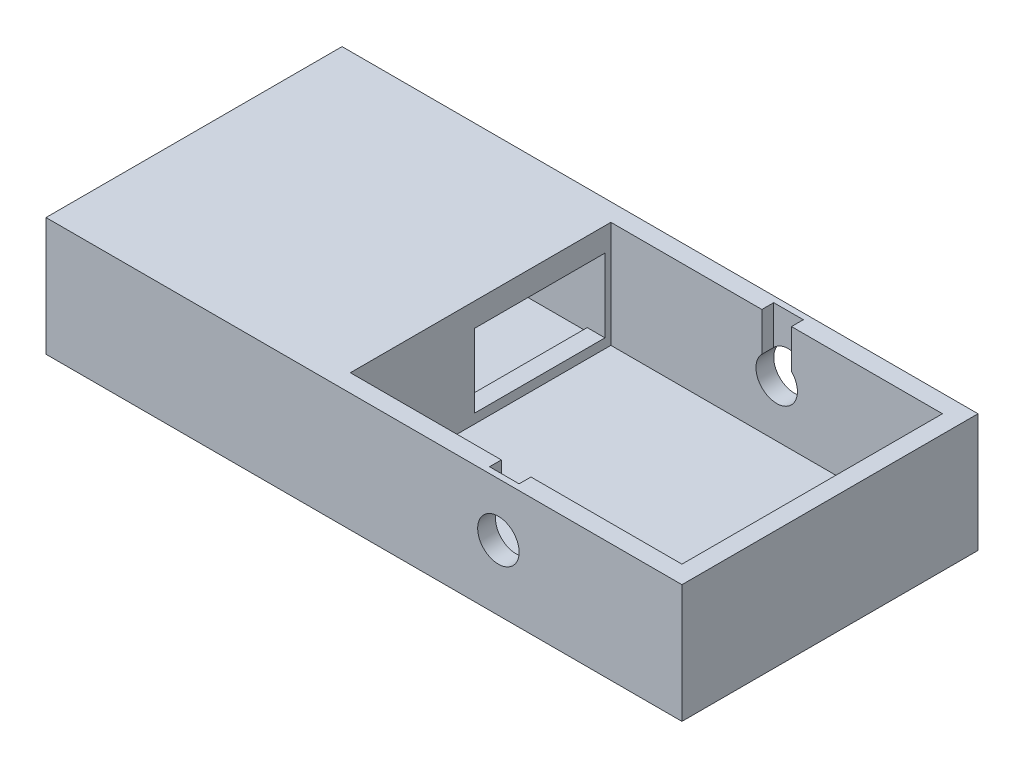
ISO-10303-21;
HEADER;
FILE_DESCRIPTION(('STEP AP214'),'2;1');
FILE_NAME('part.step','',(''),(''),'','','');
FILE_SCHEMA(('AUTOMOTIVE_DESIGN { 1 0 10303 214 1 1 1 1 }'));
ENDSEC;
DATA;
#1=APPLICATION_CONTEXT('core data for automotive mechanical design processes');
#2=APPLICATION_PROTOCOL_DEFINITION('international standard','automotive_design',2000,#1);
#3=PRODUCT_CONTEXT('',#1,'mechanical');
#4=PRODUCT('Part','Part','',(#3));
#5=PRODUCT_RELATED_PRODUCT_CATEGORY('part','',(#4));
#6=PRODUCT_DEFINITION_FORMATION('','',#4);
#7=PRODUCT_DEFINITION_CONTEXT('part definition',#1,'design');
#8=PRODUCT_DEFINITION('design','',#6,#7);
#9=PRODUCT_DEFINITION_SHAPE('','',#8);
#10=(LENGTH_UNIT() NAMED_UNIT(*) SI_UNIT(.MILLI.,.METRE.));
#11=(NAMED_UNIT(*) PLANE_ANGLE_UNIT() SI_UNIT($,.RADIAN.));
#12=(NAMED_UNIT(*) SI_UNIT($,.STERADIAN.) SOLID_ANGLE_UNIT());
#13=UNCERTAINTY_MEASURE_WITH_UNIT(LENGTH_MEASURE(1.E-05),#10,'distance_accuracy_value','');
#14=(GEOMETRIC_REPRESENTATION_CONTEXT(3) GLOBAL_UNCERTAINTY_ASSIGNED_CONTEXT((#13)) GLOBAL_UNIT_ASSIGNED_CONTEXT((#10,
#11,#12)) REPRESENTATION_CONTEXT('',''));
#15=CARTESIAN_POINT('',(0.,0.,0.));
#16=DIRECTION('',(0.,0.,1.));
#17=DIRECTION('',(1.,0.,0.));
#18=AXIS2_PLACEMENT_3D('',#15,#16,#17);
#19=CARTESIAN_POINT('',(-35.56,4.572,1.27));
#20=DIRECTION('',(0.,0.,1.));
#21=DIRECTION('',(1.,0.,0.));
#22=AXIS2_PLACEMENT_3D('',#19,#20,#21);
#23=PLANE('',#22);
#24=DIRECTION('',(0.,-1.,0.));
#25=VECTOR('',#24,1.);
#26=CARTESIAN_POINT('',(-86.868,4.572,1.27000000000001));
#27=LINE('',#26,#25);
#28=CARTESIAN_POINT('',(-86.868,20.32,1.27000000000001));
#29=VERTEX_POINT('',#28);
#30=CARTESIAN_POINT('',(-86.868,3.81,1.27));
#31=VERTEX_POINT('',#30);
#32=EDGE_CURVE('E349',#29,#31,#27,.T.);
#33=ORIENTED_EDGE('',*,*,#32,.F.);
#34=DIRECTION('',(-1.,0.,0.));
#35=VECTOR('',#34,1.);
#36=CARTESIAN_POINT('',(-35.56,20.32,1.27));
#37=LINE('',#36,#35);
#38=CARTESIAN_POINT('',(-35.56,20.32,1.27));
#39=VERTEX_POINT('',#38);
#40=EDGE_CURVE('E477',#39,#29,#37,.T.);
#41=ORIENTED_EDGE('',*,*,#40,.F.);
#42=DIRECTION('',(0.,1.,0.));
#43=VECTOR('',#42,1.);
#44=CARTESIAN_POINT('',(-35.56,4.572,1.27));
#45=LINE('',#44,#43);
#46=CARTESIAN_POINT('',(-35.56,4.572,1.27));
#47=VERTEX_POINT('',#46);
#48=EDGE_CURVE('E461',#47,#39,#45,.T.);
#49=ORIENTED_EDGE('',*,*,#48,.F.);
#50=DIRECTION('',(-1.,0.,0.));
#51=VECTOR('',#50,1.);
#52=CARTESIAN_POINT('',(-35.56,4.572,1.27));
#53=LINE('',#52,#51);
#54=CARTESIAN_POINT('',(-39.37,4.572,1.27));
#55=VERTEX_POINT('',#54);
#56=EDGE_CURVE('E481',#47,#55,#53,.T.);
#57=ORIENTED_EDGE('',*,*,#56,.T.);
#58=DIRECTION('',(0.,1.,0.));
#59=VECTOR('',#58,1.);
#60=CARTESIAN_POINT('',(-39.37,0.,1.27));
#61=LINE('',#60,#59);
#62=CARTESIAN_POINT('',(-39.37,3.81,1.27));
#63=VERTEX_POINT('',#62);
#64=EDGE_CURVE('E358',#63,#55,#61,.T.);
#65=ORIENTED_EDGE('',*,*,#64,.F.);
#66=DIRECTION('',(1.,0.,0.));
#67=VECTOR('',#66,1.);
#68=CARTESIAN_POINT('',(-88.138,3.81,1.27));
#69=LINE('',#68,#67);
#70=EDGE_CURVE('E371',#31,#63,#69,.T.);
#71=ORIENTED_EDGE('',*,*,#70,.F.);
#72=EDGE_LOOP('',(#33,#41,#49,#57,#65,#71));
#73=FACE_BOUND('',#72,.T.);
#74=ADVANCED_FACE('F112',(#73),#23,.F.);
#75=CARTESIAN_POINT('',(-35.56,4.572,-26.67));
#76=DIRECTION('',(0.,0.,-1.));
#77=DIRECTION('',(-1.,0.,0.));
#78=AXIS2_PLACEMENT_3D('',#75,#76,#77);
#79=PLANE('',#78);
#80=DIRECTION('',(0.,1.,0.));
#81=VECTOR('',#80,1.);
#82=CARTESIAN_POINT('',(-86.868,4.572,-26.67));
#83=LINE('',#82,#81);
#84=CARTESIAN_POINT('',(-86.868,3.81,-26.67));
#85=VERTEX_POINT('',#84);
#86=CARTESIAN_POINT('',(-86.868,20.32,-26.67));
#87=VERTEX_POINT('',#86);
#88=EDGE_CURVE('E346',#85,#87,#83,.T.);
#89=ORIENTED_EDGE('',*,*,#88,.F.);
#90=DIRECTION('',(1.,0.,0.));
#91=VECTOR('',#90,1.);
#92=CARTESIAN_POINT('',(-88.138,3.81,-26.67));
#93=LINE('',#92,#91);
#94=CARTESIAN_POINT('',(-39.37,3.81,-26.67));
#95=VERTEX_POINT('',#94);
#96=EDGE_CURVE('E368',#85,#95,#93,.T.);
#97=ORIENTED_EDGE('',*,*,#96,.T.);
#98=DIRECTION('',(0.,1.,0.));
#99=VECTOR('',#98,1.);
#100=CARTESIAN_POINT('',(-39.37,0.,-26.67));
#101=LINE('',#100,#99);
#102=CARTESIAN_POINT('',(-39.37,4.572,-26.67));
#103=VERTEX_POINT('',#102);
#104=EDGE_CURVE('E365',#95,#103,#101,.T.);
#105=ORIENTED_EDGE('',*,*,#104,.T.);
#106=DIRECTION('',(-1.,0.,0.));
#107=VECTOR('',#106,1.);
#108=CARTESIAN_POINT('',(-35.56,4.572,-26.67));
#109=LINE('',#108,#107);
#110=CARTESIAN_POINT('',(-35.56,4.572,-26.67));
#111=VERTEX_POINT('',#110);
#112=EDGE_CURVE('E486',#111,#103,#109,.T.);
#113=ORIENTED_EDGE('',*,*,#112,.F.);
#114=DIRECTION('',(0.,-1.,0.));
#115=VECTOR('',#114,1.);
#116=CARTESIAN_POINT('',(-35.56,4.572,-26.67));
#117=LINE('',#116,#115);
#118=CARTESIAN_POINT('',(-35.56,20.32,-26.67));
#119=VERTEX_POINT('',#118);
#120=EDGE_CURVE('E469',#119,#111,#117,.T.);
#121=ORIENTED_EDGE('',*,*,#120,.F.);
#122=DIRECTION('',(-1.,0.,0.));
#123=VECTOR('',#122,1.);
#124=CARTESIAN_POINT('',(-35.56,20.32,-26.67));
#125=LINE('',#124,#123);
#126=EDGE_CURVE('E490',#119,#87,#125,.T.);
#127=ORIENTED_EDGE('',*,*,#126,.T.);
#128=EDGE_LOOP('',(#89,#97,#105,#113,#121,#127));
#129=FACE_BOUND('',#128,.T.);
#130=ADVANCED_FACE('F623',(#129),#79,.F.);
#131=CARTESIAN_POINT('',(-35.56,20.32,-26.67));
#132=DIRECTION('',(0.,1.,0.));
#133=DIRECTION('',(0.,0.,1.));
#134=AXIS2_PLACEMENT_3D('',#131,#132,#133);
#135=PLANE('',#134);
#136=DIRECTION('',(0.,0.,1.));
#137=VECTOR('',#136,1.);
#138=CARTESIAN_POINT('',(-86.868,20.32,-26.67));
#139=LINE('',#138,#137);
#140=EDGE_CURVE('E352',#87,#29,#139,.T.);
#141=ORIENTED_EDGE('',*,*,#140,.F.);
#142=ORIENTED_EDGE('',*,*,#126,.F.);
#143=DIRECTION('',(0.,0.,-1.));
#144=VECTOR('',#143,1.);
#145=CARTESIAN_POINT('',(-35.56,20.32,-26.67));
#146=LINE('',#145,#144);
#147=EDGE_CURVE('E465',#39,#119,#146,.T.);
#148=ORIENTED_EDGE('',*,*,#147,.F.);
#149=ORIENTED_EDGE('',*,*,#40,.T.);
#150=EDGE_LOOP('',(#141,#142,#148,#149));
#151=FACE_BOUND('',#150,.T.);
#152=ADVANCED_FACE('F629',(#151),#135,.F.);
#153=CARTESIAN_POINT('',(-88.138,3.81,0.));
#154=DIRECTION('',(0.,1.,0.));
#155=DIRECTION('',(0.,0.,1.));
#156=AXIS2_PLACEMENT_3D('',#153,#154,#155);
#157=PLANE('',#156);
#158=ORIENTED_EDGE('',*,*,#96,.F.);
#159=DIRECTION('',(0.,0.,1.));
#160=VECTOR('',#159,1.);
#161=CARTESIAN_POINT('',(-86.868,3.81,0.));
#162=LINE('',#161,#160);
#163=EDGE_CURVE('E342',#85,#31,#162,.T.);
#164=ORIENTED_EDGE('',*,*,#163,.T.);
#165=ORIENTED_EDGE('',*,*,#70,.T.);
#166=DIRECTION('',(0.,0.,1.));
#167=VECTOR('',#166,1.);
#168=CARTESIAN_POINT('',(-39.37,3.81,0.));
#169=LINE('',#168,#167);
#170=EDGE_CURVE('E361',#95,#63,#169,.T.);
#171=ORIENTED_EDGE('',*,*,#170,.F.);
#172=EDGE_LOOP('',(#158,#164,#165,#171));
#173=FACE_BOUND('',#172,.T.);
#174=ADVANCED_FACE('F643',(#173),#157,.T.);
#175=CARTESIAN_POINT('',(-35.56,25.4,-27.94));
#176=DIRECTION('',(0.,0.,1.));
#177=DIRECTION('',(1.,0.,0.));
#178=AXIS2_PLACEMENT_3D('',#175,#176,#177);
#179=PLANE('',#178);
#180=CARTESIAN_POINT('',(0.,13.97,-27.94));
#181=DIRECTION('',(0.,0.,1.));
#182=DIRECTION('',(1.,0.,0.));
#183=AXIS2_PLACEMENT_3D('',#180,#181,#182);
#184=CIRCLE('',#183,4.445);
#185=CARTESIAN_POINT('',(-3.17500000000002,17.0808519733346,-27.94));
#186=VERTEX_POINT('',#185);
#187=CARTESIAN_POINT('',(3.17499999999999,17.0808519733346,-27.94));
#188=VERTEX_POINT('',#187);
#189=EDGE_CURVE('E401',#186,#188,#184,.T.);
#190=ORIENTED_EDGE('',*,*,#189,.F.);
#191=DIRECTION('',(0.,1.,0.));
#192=VECTOR('',#191,1.);
#193=CARTESIAN_POINT('',(-3.17500000000002,0.,-27.94));
#194=LINE('',#193,#192);
#195=CARTESIAN_POINT('',(-3.17500000000002,25.4,-27.94));
#196=VERTEX_POINT('',#195);
#197=EDGE_CURVE('E380',#186,#196,#194,.T.);
#198=ORIENTED_EDGE('',*,*,#197,.T.);
#199=DIRECTION('',(-1.,0.,0.));
#200=VECTOR('',#199,1.);
#201=CARTESIAN_POINT('',(-35.56,25.4,-27.94));
#202=LINE('',#201,#200);
#203=CARTESIAN_POINT('',(-35.56,25.4,-27.94));
#204=VERTEX_POINT('',#203);
#205=EDGE_CURVE('E499',#196,#204,#202,.T.);
#206=ORIENTED_EDGE('',*,*,#205,.T.);
#207=DIRECTION('',(0.,-1.,0.));
#208=VECTOR('',#207,1.);
#209=CARTESIAN_POINT('',(-35.56,25.4,-27.94));
#210=LINE('',#209,#208);
#211=CARTESIAN_POINT('',(-35.56,2.54,-27.94));
#212=VERTEX_POINT('',#211);
#213=EDGE_CURVE('E520',#204,#212,#210,.T.);
#214=ORIENTED_EDGE('',*,*,#213,.T.);
#215=DIRECTION('',(1.,0.,0.));
#216=VECTOR('',#215,1.);
#217=CARTESIAN_POINT('',(-35.56,2.54,-27.94));
#218=LINE('',#217,#216);
#219=CARTESIAN_POINT('',(35.56,2.54,-27.94));
#220=VERTEX_POINT('',#219);
#221=EDGE_CURVE('E565',#212,#220,#218,.T.);
#222=ORIENTED_EDGE('',*,*,#221,.T.);
#223=DIRECTION('',(0.,-1.,0.));
#224=VECTOR('',#223,1.);
#225=CARTESIAN_POINT('',(35.56,25.4,-27.94));
#226=LINE('',#225,#224);
#227=CARTESIAN_POINT('',(35.56,25.4,-27.94));
#228=VERTEX_POINT('',#227);
#229=EDGE_CURVE('E524',#228,#220,#226,.T.);
#230=ORIENTED_EDGE('',*,*,#229,.F.);
#231=CARTESIAN_POINT('',(3.17499999999998,25.4,-27.94));
#232=VERTEX_POINT('',#231);
#233=EDGE_CURVE('E500',#228,#232,#202,.T.);
#234=ORIENTED_EDGE('',*,*,#233,.T.);
#235=DIRECTION('',(0.,1.,0.));
#236=VECTOR('',#235,1.);
#237=CARTESIAN_POINT('',(3.17499999999999,0.,-27.94));
#238=LINE('',#237,#236);
#239=EDGE_CURVE('E374',#188,#232,#238,.T.);
#240=ORIENTED_EDGE('',*,*,#239,.F.);
#241=EDGE_LOOP('',(#190,#198,#206,#214,#222,#230,#234,#240));
#242=FACE_BOUND('',#241,.T.);
#243=ADVANCED_FACE('F579',(#242),#179,.T.);
#244=CARTESIAN_POINT('',(0.,25.4,0.));
#245=DIRECTION('',(0.,1.,0.));
#246=DIRECTION('',(0.,0.,1.));
#247=AXIS2_PLACEMENT_3D('',#244,#245,#246);
#248=PLANE('',#247);
#249=DIRECTION('',(1.,0.,0.));
#250=VECTOR('',#249,1.);
#251=CARTESIAN_POINT('',(-39.37,25.4,31.75));
#252=LINE('',#251,#250);
#253=CARTESIAN_POINT('',(-97.028,25.4,31.75));
#254=VERTEX_POINT('',#253);
#255=CARTESIAN_POINT('',(39.37,25.4,31.75));
#256=VERTEX_POINT('',#255);
#257=EDGE_CURVE('E538',#254,#256,#252,.T.);
#258=ORIENTED_EDGE('',*,*,#257,.T.);
#259=DIRECTION('',(0.,0.,-1.));
#260=VECTOR('',#259,1.);
#261=CARTESIAN_POINT('',(39.37,25.4,-31.75));
#262=LINE('',#261,#260);
#263=CARTESIAN_POINT('',(39.37,25.4,-31.75));
#264=VERTEX_POINT('',#263);
#265=EDGE_CURVE('E529',#256,#264,#262,.T.);
#266=ORIENTED_EDGE('',*,*,#265,.T.);
#267=DIRECTION('',(-1.,0.,0.));
#268=VECTOR('',#267,1.);
#269=CARTESIAN_POINT('',(-39.37,25.4,-31.75));
#270=LINE('',#269,#268);
#271=CARTESIAN_POINT('',(-97.028,25.4,-31.75));
#272=VERTEX_POINT('',#271);
#273=EDGE_CURVE('E533',#264,#272,#270,.T.);
#274=ORIENTED_EDGE('',*,*,#273,.T.);
#275=DIRECTION('',(0.,0.,-1.));
#276=VECTOR('',#275,1.);
#277=CARTESIAN_POINT('',(-97.028,25.4,-31.75));
#278=LINE('',#277,#276);
#279=EDGE_CURVE('E339',#254,#272,#278,.T.);
#280=ORIENTED_EDGE('',*,*,#279,.F.);
#281=EDGE_LOOP('',(#258,#266,#274,#280));
#282=FACE_BOUND('',#281,.T.);
#283=ORIENTED_EDGE('',*,*,#205,.F.);
#284=DIRECTION('',(0.,0.,1.));
#285=VECTOR('',#284,1.);
#286=CARTESIAN_POINT('',(-3.17500000000002,25.4,-30.48));
#287=LINE('',#286,#285);
#288=CARTESIAN_POINT('',(-3.17500000000002,25.4,-30.48));
#289=VERTEX_POINT('',#288);
#290=EDGE_CURVE('E402',#289,#196,#287,.T.);
#291=ORIENTED_EDGE('',*,*,#290,.F.);
#292=DIRECTION('',(-1.,0.,0.));
#293=VECTOR('',#292,1.);
#294=CARTESIAN_POINT('',(0.,25.4,-30.48));
#295=LINE('',#294,#293);
#296=CARTESIAN_POINT('',(3.17499999999998,25.4,-30.48));
#297=VERTEX_POINT('',#296);
#298=EDGE_CURVE('E384',#297,#289,#295,.T.);
#299=ORIENTED_EDGE('',*,*,#298,.F.);
#300=DIRECTION('',(0.,0.,1.));
#301=VECTOR('',#300,1.);
#302=CARTESIAN_POINT('',(3.17499999999998,25.4,-30.48));
#303=LINE('',#302,#301);
#304=EDGE_CURVE('E405',#297,#232,#303,.T.);
#305=ORIENTED_EDGE('',*,*,#304,.T.);
#306=ORIENTED_EDGE('',*,*,#233,.F.);
#307=DIRECTION('',(0.,0.,-1.));
#308=VECTOR('',#307,1.);
#309=CARTESIAN_POINT('',(35.56,25.4,-27.94));
#310=LINE('',#309,#308);
#311=CARTESIAN_POINT('',(35.56,25.4,27.94));
#312=VERTEX_POINT('',#311);
#313=EDGE_CURVE('E485',#312,#228,#310,.T.);
#314=ORIENTED_EDGE('',*,*,#313,.F.);
#315=DIRECTION('',(1.,0.,0.));
#316=VECTOR('',#315,1.);
#317=CARTESIAN_POINT('',(-35.56,25.4,27.94));
#318=LINE('',#317,#316);
#319=CARTESIAN_POINT('',(3.17499999999999,25.4,27.94));
#320=VERTEX_POINT('',#319);
#321=EDGE_CURVE('E508',#320,#312,#318,.T.);
#322=ORIENTED_EDGE('',*,*,#321,.F.);
#323=DIRECTION('',(0.,0.,-1.));
#324=VECTOR('',#323,1.);
#325=CARTESIAN_POINT('',(3.17499999999999,25.4,30.48));
#326=LINE('',#325,#324);
#327=CARTESIAN_POINT('',(3.17499999999999,25.4,30.48));
#328=VERTEX_POINT('',#327);
#329=EDGE_CURVE('E444',#328,#320,#326,.T.);
#330=ORIENTED_EDGE('',*,*,#329,.F.);
#331=DIRECTION('',(1.,0.,0.));
#332=VECTOR('',#331,1.);
#333=CARTESIAN_POINT('',(0.,25.4,30.48));
#334=LINE('',#333,#332);
#335=CARTESIAN_POINT('',(-3.17500000000001,25.4,30.48));
#336=VERTEX_POINT('',#335);
#337=EDGE_CURVE('E427',#336,#328,#334,.T.);
#338=ORIENTED_EDGE('',*,*,#337,.F.);
#339=DIRECTION('',(0.,0.,-1.));
#340=VECTOR('',#339,1.);
#341=CARTESIAN_POINT('',(-3.17500000000001,25.4,30.48));
#342=LINE('',#341,#340);
#343=CARTESIAN_POINT('',(-3.17500000000001,25.4,27.94));
#344=VERTEX_POINT('',#343);
#345=EDGE_CURVE('E447',#336,#344,#342,.T.);
#346=ORIENTED_EDGE('',*,*,#345,.T.);
#347=CARTESIAN_POINT('',(-35.56,25.4,27.94));
#348=VERTEX_POINT('',#347);
#349=EDGE_CURVE('E509',#348,#344,#318,.T.);
#350=ORIENTED_EDGE('',*,*,#349,.F.);
#351=DIRECTION('',(0.,0.,1.));
#352=VECTOR('',#351,1.);
#353=CARTESIAN_POINT('',(-35.56,25.4,-27.94));
#354=LINE('',#353,#352);
#355=EDGE_CURVE('E504',#204,#348,#354,.T.);
#356=ORIENTED_EDGE('',*,*,#355,.F.);
#357=EDGE_LOOP('',(#283,#291,#299,#305,#306,#314,#322,#330,#338,#346,#350,#356));
#358=FACE_BOUND('',#357,.T.);
#359=ADVANCED_FACE('F597',(#282,#358),#248,.T.);
#360=CARTESIAN_POINT('',(0.,13.97,-31.75));
#361=DIRECTION('',(0.,0.,1.));
#362=DIRECTION('',(1.,0.,0.));
#363=AXIS2_PLACEMENT_3D('',#360,#361,#362);
#364=CYLINDRICAL_SURFACE('',#363,4.445);
#365=CARTESIAN_POINT('',(0.,13.97,-31.75));
#366=DIRECTION('',(0.,0.,1.));
#367=DIRECTION('',(1.,0.,0.));
#368=AXIS2_PLACEMENT_3D('',#365,#366,#367);
#369=CIRCLE('',#368,4.445);
#370=CARTESIAN_POINT('',(4.44499999999999,13.97,-31.75));
#371=VERTEX_POINT('',#370);
#372=EDGE_CURVE('E411',#371,#371,#369,.T.);
#373=ORIENTED_EDGE('',*,*,#372,.F.);
#374=EDGE_LOOP('',(#373));
#375=FACE_BOUND('',#374,.T.);
#376=DIRECTION('',(0.,0.,1.));
#377=VECTOR('',#376,1.);
#378=CARTESIAN_POINT('',(-3.17500000000002,17.0808519733346,-30.48));
#379=LINE('',#378,#377);
#380=CARTESIAN_POINT('',(-3.17500000000002,17.0808519733346,-30.48));
#381=VERTEX_POINT('',#380);
#382=EDGE_CURVE('E397',#381,#186,#379,.T.);
#383=ORIENTED_EDGE('',*,*,#382,.T.);
#384=ORIENTED_EDGE('',*,*,#189,.T.);
#385=DIRECTION('',(0.,0.,1.));
#386=VECTOR('',#385,1.);
#387=CARTESIAN_POINT('',(3.17499999999999,17.0808519733346,-30.48));
#388=LINE('',#387,#386);
#389=CARTESIAN_POINT('',(3.17499999999999,17.0808519733346,-30.48));
#390=VERTEX_POINT('',#389);
#391=EDGE_CURVE('E391',#390,#188,#388,.T.);
#392=ORIENTED_EDGE('',*,*,#391,.F.);
#393=CARTESIAN_POINT('',(0.,13.97,-30.48));
#394=DIRECTION('',(0.,0.,1.));
#395=DIRECTION('',(1.,0.,0.));
#396=AXIS2_PLACEMENT_3D('',#393,#394,#395);
#397=CIRCLE('',#396,4.445);
#398=EDGE_CURVE('E375',#390,#381,#397,.T.);
#399=ORIENTED_EDGE('',*,*,#398,.T.);
#400=EDGE_LOOP('',(#383,#384,#392,#399));
#401=FACE_BOUND('',#400,.T.);
#402=ADVANCED_FACE('F603',(#375,#401),#364,.F.);
#403=CARTESIAN_POINT('',(0.,2.54,0.));
#404=DIRECTION('',(0.,-1.,0.));
#405=DIRECTION('',(0.,0.,-1.));
#406=AXIS2_PLACEMENT_3D('',#403,#404,#405);
#407=PLANE('',#406);
#408=DIRECTION('',(1.,0.,0.));
#409=VECTOR('',#408,1.);
#410=CARTESIAN_POINT('',(-35.56,2.54,27.94));
#411=LINE('',#410,#409);
#412=CARTESIAN_POINT('',(-35.56,2.54,27.94));
#413=VERTEX_POINT('',#412);
#414=CARTESIAN_POINT('',(35.56,2.54,27.94));
#415=VERTEX_POINT('',#414);
#416=EDGE_CURVE('E557',#413,#415,#411,.T.);
#417=ORIENTED_EDGE('',*,*,#416,.T.);
#418=DIRECTION('',(0.,0.,1.));
#419=VECTOR('',#418,1.);
#420=CARTESIAN_POINT('',(35.56,2.54,-27.94));
#421=LINE('',#420,#419);
#422=EDGE_CURVE('E561',#220,#415,#421,.T.);
#423=ORIENTED_EDGE('',*,*,#422,.F.);
#424=ORIENTED_EDGE('',*,*,#221,.F.);
#425=DIRECTION('',(0.,0.,1.));
#426=VECTOR('',#425,1.);
#427=CARTESIAN_POINT('',(-35.56,2.54,-27.94));
#428=LINE('',#427,#426);
#429=EDGE_CURVE('E122',#212,#413,#428,.T.);
#430=ORIENTED_EDGE('',*,*,#429,.T.);
#431=EDGE_LOOP('',(#417,#423,#424,#430));
#432=FACE_BOUND('',#431,.T.);
#433=ADVANCED_FACE('F571',(#432),#407,.F.);
#434=CARTESIAN_POINT('',(35.56,25.4,-27.94));
#435=DIRECTION('',(-1.,0.,0.));
#436=DIRECTION('',(0.,0.,1.));
#437=AXIS2_PLACEMENT_3D('',#434,#435,#436);
#438=PLANE('',#437);
#439=ORIENTED_EDGE('',*,*,#422,.T.);
#440=DIRECTION('',(0.,-1.,0.));
#441=VECTOR('',#440,1.);
#442=CARTESIAN_POINT('',(35.56,25.4,27.94));
#443=LINE('',#442,#441);
#444=EDGE_CURVE('E513',#312,#415,#443,.T.);
#445=ORIENTED_EDGE('',*,*,#444,.F.);
#446=ORIENTED_EDGE('',*,*,#313,.T.);
#447=ORIENTED_EDGE('',*,*,#229,.T.);
#448=EDGE_LOOP('',(#439,#445,#446,#447));
#449=FACE_BOUND('',#448,.T.);
#450=ADVANCED_FACE('F595',(#449),#438,.T.);
#451=CARTESIAN_POINT('',(-35.56,25.4,-27.94));
#452=DIRECTION('',(1.,0.,0.));
#453=DIRECTION('',(0.,0.,-1.));
#454=AXIS2_PLACEMENT_3D('',#451,#452,#453);
#455=PLANE('',#454);
#456=ORIENTED_EDGE('',*,*,#48,.T.);
#457=ORIENTED_EDGE('',*,*,#147,.T.);
#458=ORIENTED_EDGE('',*,*,#120,.T.);
#459=DIRECTION('',(0.,0.,1.));
#460=VECTOR('',#459,1.);
#461=CARTESIAN_POINT('',(-35.56,4.572,-26.67));
#462=LINE('',#461,#460);
#463=EDGE_CURVE('E473',#111,#47,#462,.T.);
#464=ORIENTED_EDGE('',*,*,#463,.T.);
#465=EDGE_LOOP('',(#456,#457,#458,#464));
#466=FACE_BOUND('',#465,.T.);
#467=ORIENTED_EDGE('',*,*,#429,.F.);
#468=ORIENTED_EDGE('',*,*,#213,.F.);
#469=ORIENTED_EDGE('',*,*,#355,.T.);
#470=DIRECTION('',(0.,-1.,0.));
#471=VECTOR('',#470,1.);
#472=CARTESIAN_POINT('',(-35.56,25.4,27.94));
#473=LINE('',#472,#471);
#474=EDGE_CURVE('E516',#348,#413,#473,.T.);
#475=ORIENTED_EDGE('',*,*,#474,.T.);
#476=EDGE_LOOP('',(#467,#468,#469,#475));
#477=FACE_BOUND('',#476,.T.);
#478=ADVANCED_FACE('F575',(#466,#477),#455,.T.);
#479=CARTESIAN_POINT('',(-35.56,25.4,27.94));
#480=DIRECTION('',(0.,0.,-1.));
#481=DIRECTION('',(-1.,0.,0.));
#482=AXIS2_PLACEMENT_3D('',#479,#480,#481);
#483=PLANE('',#482);
#484=DIRECTION('',(0.,-1.,0.));
#485=VECTOR('',#484,1.);
#486=CARTESIAN_POINT('',(3.17499999999999,0.,27.94));
#487=LINE('',#486,#485);
#488=CARTESIAN_POINT('',(3.17499999999999,17.0808519733346,27.94));
#489=VERTEX_POINT('',#488);
#490=EDGE_CURVE('E424',#320,#489,#487,.T.);
#491=ORIENTED_EDGE('',*,*,#490,.F.);
#492=ORIENTED_EDGE('',*,*,#321,.T.);
#493=ORIENTED_EDGE('',*,*,#444,.T.);
#494=ORIENTED_EDGE('',*,*,#416,.F.);
#495=ORIENTED_EDGE('',*,*,#474,.F.);
#496=ORIENTED_EDGE('',*,*,#349,.T.);
#497=DIRECTION('',(0.,-1.,0.));
#498=VECTOR('',#497,1.);
#499=CARTESIAN_POINT('',(-3.17500000000001,0.,27.94));
#500=LINE('',#499,#498);
#501=CARTESIAN_POINT('',(-3.17500000000001,17.0808519733346,27.94));
#502=VERTEX_POINT('',#501);
#503=EDGE_CURVE('E415',#344,#502,#500,.T.);
#504=ORIENTED_EDGE('',*,*,#503,.T.);
#505=CARTESIAN_POINT('',(0.,13.97,27.94));
#506=DIRECTION('',(0.,0.,-1.));
#507=DIRECTION('',(-1.,0.,0.));
#508=AXIS2_PLACEMENT_3D('',#505,#506,#507);
#509=CIRCLE('',#508,4.445);
#510=EDGE_CURVE('E443',#489,#502,#509,.T.);
#511=ORIENTED_EDGE('',*,*,#510,.F.);
#512=EDGE_LOOP('',(#491,#492,#493,#494,#495,#496,#504,#511));
#513=FACE_BOUND('',#512,.T.);
#514=ADVANCED_FACE('F590',(#513),#483,.T.);
#515=CARTESIAN_POINT('',(39.37,25.4,-31.75));
#516=DIRECTION('',(-1.,0.,0.));
#517=DIRECTION('',(0.,0.,1.));
#518=AXIS2_PLACEMENT_3D('',#515,#516,#517);
#519=PLANE('',#518);
#520=DIRECTION('',(0.,0.,-1.));
#521=VECTOR('',#520,1.);
#522=CARTESIAN_POINT('',(39.37,0.,-31.75));
#523=LINE('',#522,#521);
#524=CARTESIAN_POINT('',(39.37,0.,31.75));
#525=VERTEX_POINT('',#524);
#526=CARTESIAN_POINT('',(39.37,0.,-31.75));
#527=VERTEX_POINT('',#526);
#528=EDGE_CURVE('E528',#525,#527,#523,.T.);
#529=ORIENTED_EDGE('',*,*,#528,.T.);
#530=DIRECTION('',(0.,-1.,0.));
#531=VECTOR('',#530,1.);
#532=CARTESIAN_POINT('',(39.37,25.4,-31.75));
#533=LINE('',#532,#531);
#534=EDGE_CURVE('E553',#264,#527,#533,.T.);
#535=ORIENTED_EDGE('',*,*,#534,.F.);
#536=ORIENTED_EDGE('',*,*,#265,.F.);
#537=DIRECTION('',(0.,-1.,0.));
#538=VECTOR('',#537,1.);
#539=CARTESIAN_POINT('',(39.37,25.4,31.75));
#540=LINE('',#539,#538);
#541=EDGE_CURVE('E541',#256,#525,#540,.T.);
#542=ORIENTED_EDGE('',*,*,#541,.T.);
#543=EDGE_LOOP('',(#529,#535,#536,#542));
#544=FACE_BOUND('',#543,.T.);
#545=ADVANCED_FACE('F637',(#544),#519,.F.);
#546=CARTESIAN_POINT('',(-39.37,25.4,-31.75));
#547=DIRECTION('',(0.,0.,1.));
#548=DIRECTION('',(1.,0.,0.));
#549=AXIS2_PLACEMENT_3D('',#546,#547,#548);
#550=PLANE('',#549);
#551=DIRECTION('',(0.,-1.,0.));
#552=VECTOR('',#551,1.);
#553=CARTESIAN_POINT('',(-97.028,25.4,-31.75));
#554=LINE('',#553,#552);
#555=CARTESIAN_POINT('',(-97.028,0.,-31.75));
#556=VERTEX_POINT('',#555);
#557=EDGE_CURVE('E325',#272,#556,#554,.T.);
#558=ORIENTED_EDGE('',*,*,#557,.F.);
#559=ORIENTED_EDGE('',*,*,#273,.F.);
#560=ORIENTED_EDGE('',*,*,#534,.T.);
#561=DIRECTION('',(-1.,0.,0.));
#562=VECTOR('',#561,1.);
#563=CARTESIAN_POINT('',(-39.37,0.,-31.75));
#564=LINE('',#563,#562);
#565=EDGE_CURVE('E545',#527,#556,#564,.T.);
#566=ORIENTED_EDGE('',*,*,#565,.T.);
#567=EDGE_LOOP('',(#558,#559,#560,#566));
#568=FACE_BOUND('',#567,.T.);
#569=ORIENTED_EDGE('',*,*,#372,.T.);
#570=EDGE_LOOP('',(#569));
#571=FACE_BOUND('',#570,.T.);
#572=ADVANCED_FACE('F656',(#568,#571),#550,.F.);
#573=CARTESIAN_POINT('',(-39.37,25.4,-31.75));
#574=DIRECTION('',(1.,0.,0.));
#575=DIRECTION('',(0.,0.,-1.));
#576=AXIS2_PLACEMENT_3D('',#573,#574,#575);
#577=PLANE('',#576);
#578=ORIENTED_EDGE('',*,*,#170,.T.);
#579=ORIENTED_EDGE('',*,*,#64,.T.);
#580=DIRECTION('',(0.,0.,1.));
#581=VECTOR('',#580,1.);
#582=CARTESIAN_POINT('',(-39.37,4.572,-26.67));
#583=LINE('',#582,#581);
#584=EDGE_CURVE('E457',#103,#55,#583,.T.);
#585=ORIENTED_EDGE('',*,*,#584,.F.);
#586=ORIENTED_EDGE('',*,*,#104,.F.);
#587=EDGE_LOOP('',(#578,#579,#585,#586));
#588=FACE_BOUND('',#587,.T.);
#589=ADVANCED_FACE('F652',(#588),#577,.F.);
#590=CARTESIAN_POINT('',(-39.37,25.4,31.75));
#591=DIRECTION('',(0.,0.,-1.));
#592=DIRECTION('',(-1.,0.,0.));
#593=AXIS2_PLACEMENT_3D('',#590,#591,#592);
#594=PLANE('',#593);
#595=ORIENTED_EDGE('',*,*,#541,.F.);
#596=ORIENTED_EDGE('',*,*,#257,.F.);
#597=DIRECTION('',(0.,-1.,0.));
#598=VECTOR('',#597,1.);
#599=CARTESIAN_POINT('',(-97.028,0.,31.75));
#600=LINE('',#599,#598);
#601=CARTESIAN_POINT('',(-97.028,0.,31.75));
#602=VERTEX_POINT('',#601);
#603=EDGE_CURVE('E311',#254,#602,#600,.T.);
#604=ORIENTED_EDGE('',*,*,#603,.T.);
#605=DIRECTION('',(1.,0.,0.));
#606=VECTOR('',#605,1.);
#607=CARTESIAN_POINT('',(-39.37,0.,31.75));
#608=LINE('',#607,#606);
#609=EDGE_CURVE('E534',#602,#525,#608,.T.);
#610=ORIENTED_EDGE('',*,*,#609,.T.);
#611=EDGE_LOOP('',(#595,#596,#604,#610));
#612=FACE_BOUND('',#611,.T.);
#613=CARTESIAN_POINT('',(0.,13.97,31.75));
#614=DIRECTION('',(0.,0.,-1.));
#615=DIRECTION('',(-1.,0.,0.));
#616=AXIS2_PLACEMENT_3D('',#613,#614,#615);
#617=CIRCLE('',#616,4.445);
#618=CARTESIAN_POINT('',(-4.44500000000001,13.97,31.75));
#619=VERTEX_POINT('',#618);
#620=EDGE_CURVE('E453',#619,#619,#617,.T.);
#621=ORIENTED_EDGE('',*,*,#620,.T.);
#622=EDGE_LOOP('',(#621));
#623=FACE_BOUND('',#622,.T.);
#624=ADVANCED_FACE('F649',(#612,#623),#594,.F.);
#625=CARTESIAN_POINT('',(0.,0.,0.));
#626=DIRECTION('',(0.,-1.,0.));
#627=DIRECTION('',(0.,0.,-1.));
#628=AXIS2_PLACEMENT_3D('',#625,#626,#627);
#629=PLANE('',#628);
#630=ORIENTED_EDGE('',*,*,#528,.F.);
#631=ORIENTED_EDGE('',*,*,#609,.F.);
#632=DIRECTION('',(0.,0.,1.));
#633=VECTOR('',#632,1.);
#634=CARTESIAN_POINT('',(-97.028,0.,-31.75));
#635=LINE('',#634,#633);
#636=EDGE_CURVE('E336',#556,#602,#635,.T.);
#637=ORIENTED_EDGE('',*,*,#636,.F.);
#638=ORIENTED_EDGE('',*,*,#565,.F.);
#639=EDGE_LOOP('',(#630,#631,#637,#638));
#640=FACE_BOUND('',#639,.T.);
#641=ADVANCED_FACE('F114',(#640),#629,.T.);
#642=CARTESIAN_POINT('',(-35.56,4.572,-26.67));
#643=DIRECTION('',(0.,-1.,0.));
#644=DIRECTION('',(0.,0.,-1.));
#645=AXIS2_PLACEMENT_3D('',#642,#643,#644);
#646=PLANE('',#645);
#647=ORIENTED_EDGE('',*,*,#584,.T.);
#648=ORIENTED_EDGE('',*,*,#56,.F.);
#649=ORIENTED_EDGE('',*,*,#463,.F.);
#650=ORIENTED_EDGE('',*,*,#112,.T.);
#651=EDGE_LOOP('',(#647,#648,#649,#650));
#652=FACE_BOUND('',#651,.T.);
#653=ADVANCED_FACE('F686',(#652),#646,.F.);
#654=CARTESIAN_POINT('',(0.,13.97,31.75));
#655=DIRECTION('',(0.,0.,-1.));
#656=DIRECTION('',(-1.,0.,0.));
#657=AXIS2_PLACEMENT_3D('',#654,#655,#656);
#658=CYLINDRICAL_SURFACE('',#657,4.445);
#659=CARTESIAN_POINT('',(0.,13.97,30.48));
#660=DIRECTION('',(0.,0.,-1.));
#661=DIRECTION('',(-1.,0.,0.));
#662=AXIS2_PLACEMENT_3D('',#659,#660,#661);
#663=CIRCLE('',#662,4.445);
#664=CARTESIAN_POINT('',(-3.17500000000001,17.0808519733346,30.48));
#665=VERTEX_POINT('',#664);
#666=CARTESIAN_POINT('',(3.17499999999999,17.0808519733346,30.48));
#667=VERTEX_POINT('',#666);
#668=EDGE_CURVE('E419',#665,#667,#663,.T.);
#669=ORIENTED_EDGE('',*,*,#668,.T.);
#670=DIRECTION('',(0.,0.,-1.));
#671=VECTOR('',#670,1.);
#672=CARTESIAN_POINT('',(3.17499999999999,17.0808519733346,30.48));
#673=LINE('',#672,#671);
#674=EDGE_CURVE('E439',#667,#489,#673,.T.);
#675=ORIENTED_EDGE('',*,*,#674,.T.);
#676=ORIENTED_EDGE('',*,*,#510,.T.);
#677=DIRECTION('',(0.,0.,-1.));
#678=VECTOR('',#677,1.);
#679=CARTESIAN_POINT('',(-3.17500000000001,17.0808519733346,30.48));
#680=LINE('',#679,#678);
#681=EDGE_CURVE('E433',#665,#502,#680,.T.);
#682=ORIENTED_EDGE('',*,*,#681,.F.);
#683=EDGE_LOOP('',(#669,#675,#676,#682));
#684=FACE_BOUND('',#683,.T.);
#685=ORIENTED_EDGE('',*,*,#620,.F.);
#686=EDGE_LOOP('',(#685));
#687=FACE_BOUND('',#686,.T.);
#688=ADVANCED_FACE('F679',(#684,#687),#658,.F.);
#689=CARTESIAN_POINT('',(3.17499999999999,0.,30.48));
#690=DIRECTION('',(1.,0.,0.));
#691=DIRECTION('',(0.,0.,-1.));
#692=AXIS2_PLACEMENT_3D('',#689,#690,#691);
#693=PLANE('',#692);
#694=ORIENTED_EDGE('',*,*,#490,.T.);
#695=ORIENTED_EDGE('',*,*,#674,.F.);
#696=DIRECTION('',(0.,-1.,0.));
#697=VECTOR('',#696,1.);
#698=CARTESIAN_POINT('',(3.17499999999999,0.,30.48));
#699=LINE('',#698,#697);
#700=EDGE_CURVE('E430',#328,#667,#699,.T.);
#701=ORIENTED_EDGE('',*,*,#700,.F.);
#702=ORIENTED_EDGE('',*,*,#329,.T.);
#703=EDGE_LOOP('',(#694,#695,#701,#702));
#704=FACE_BOUND('',#703,.T.);
#705=ADVANCED_FACE('F676',(#704),#693,.F.);
#706=CARTESIAN_POINT('',(-3.17500000000001,0.,30.48));
#707=DIRECTION('',(1.,0.,0.));
#708=DIRECTION('',(0.,0.,-1.));
#709=AXIS2_PLACEMENT_3D('',#706,#707,#708);
#710=PLANE('',#709);
#711=ORIENTED_EDGE('',*,*,#503,.F.);
#712=ORIENTED_EDGE('',*,*,#345,.F.);
#713=DIRECTION('',(0.,-1.,0.));
#714=VECTOR('',#713,1.);
#715=CARTESIAN_POINT('',(-3.17500000000001,0.,30.48));
#716=LINE('',#715,#714);
#717=EDGE_CURVE('E423',#336,#665,#716,.T.);
#718=ORIENTED_EDGE('',*,*,#717,.T.);
#719=ORIENTED_EDGE('',*,*,#681,.T.);
#720=EDGE_LOOP('',(#711,#712,#718,#719));
#721=FACE_BOUND('',#720,.T.);
#722=ADVANCED_FACE('F674',(#721),#710,.T.);
#723=CARTESIAN_POINT('',(0.,0.,30.48));
#724=DIRECTION('',(0.,0.,-1.));
#725=DIRECTION('',(-1.,0.,0.));
#726=AXIS2_PLACEMENT_3D('',#723,#724,#725);
#727=PLANE('',#726);
#728=ORIENTED_EDGE('',*,*,#668,.F.);
#729=ORIENTED_EDGE('',*,*,#717,.F.);
#730=ORIENTED_EDGE('',*,*,#337,.T.);
#731=ORIENTED_EDGE('',*,*,#700,.T.);
#732=EDGE_LOOP('',(#728,#729,#730,#731));
#733=FACE_BOUND('',#732,.T.);
#734=ADVANCED_FACE('F619',(#733),#727,.T.);
#735=CARTESIAN_POINT('',(-3.17500000000002,0.,-30.48));
#736=DIRECTION('',(1.,0.,0.));
#737=DIRECTION('',(0.,0.,-1.));
#738=AXIS2_PLACEMENT_3D('',#735,#736,#737);
#739=PLANE('',#738);
#740=ORIENTED_EDGE('',*,*,#197,.F.);
#741=ORIENTED_EDGE('',*,*,#382,.F.);
#742=DIRECTION('',(0.,1.,0.));
#743=VECTOR('',#742,1.);
#744=CARTESIAN_POINT('',(-3.17500000000002,0.,-30.48));
#745=LINE('',#744,#743);
#746=EDGE_CURVE('E388',#381,#289,#745,.T.);
#747=ORIENTED_EDGE('',*,*,#746,.T.);
#748=ORIENTED_EDGE('',*,*,#290,.T.);
#749=EDGE_LOOP('',(#740,#741,#747,#748));
#750=FACE_BOUND('',#749,.T.);
#751=ADVANCED_FACE('F606',(#750),#739,.T.);
#752=CARTESIAN_POINT('',(3.17499999999999,0.,-30.48));
#753=DIRECTION('',(1.,0.,0.));
#754=DIRECTION('',(0.,1.,0.));
#755=AXIS2_PLACEMENT_3D('',#752,#753,#754);
#756=PLANE('',#755);
#757=ORIENTED_EDGE('',*,*,#239,.T.);
#758=ORIENTED_EDGE('',*,*,#304,.F.);
#759=DIRECTION('',(0.,1.,0.));
#760=VECTOR('',#759,1.);
#761=CARTESIAN_POINT('',(3.17499999999999,0.,-30.48));
#762=LINE('',#761,#760);
#763=EDGE_CURVE('E379',#390,#297,#762,.T.);
#764=ORIENTED_EDGE('',*,*,#763,.F.);
#765=ORIENTED_EDGE('',*,*,#391,.T.);
#766=EDGE_LOOP('',(#757,#758,#764,#765));
#767=FACE_BOUND('',#766,.T.);
#768=ADVANCED_FACE('F610',(#767),#756,.F.);
#769=CARTESIAN_POINT('',(0.,0.,-30.48));
#770=DIRECTION('',(0.,0.,1.));
#771=DIRECTION('',(1.,0.,0.));
#772=AXIS2_PLACEMENT_3D('',#769,#770,#771);
#773=PLANE('',#772);
#774=ORIENTED_EDGE('',*,*,#398,.F.);
#775=ORIENTED_EDGE('',*,*,#763,.T.);
#776=ORIENTED_EDGE('',*,*,#298,.T.);
#777=ORIENTED_EDGE('',*,*,#746,.F.);
#778=EDGE_LOOP('',(#774,#775,#776,#777));
#779=FACE_BOUND('',#778,.T.);
#780=ADVANCED_FACE('F608',(#779),#773,.T.);
#781=CARTESIAN_POINT('',(-97.028,0.,0.));
#782=DIRECTION('',(-1.,0.,0.));
#783=DIRECTION('',(0.,0.,1.));
#784=AXIS2_PLACEMENT_3D('',#781,#782,#783);
#785=PLANE('',#784);
#786=ORIENTED_EDGE('',*,*,#279,.T.);
#787=ORIENTED_EDGE('',*,*,#557,.T.);
#788=ORIENTED_EDGE('',*,*,#636,.T.);
#789=ORIENTED_EDGE('',*,*,#603,.F.);
#790=EDGE_LOOP('',(#786,#787,#788,#789));
#791=FACE_BOUND('',#790,.T.);
#792=ADVANCED_FACE('F617',(#791),#785,.T.);
#793=CARTESIAN_POINT('',(-86.868,0.,0.));
#794=DIRECTION('',(-1.,0.,0.));
#795=DIRECTION('',(0.,0.,1.));
#796=AXIS2_PLACEMENT_3D('',#793,#794,#795);
#797=PLANE('',#796);
#798=ORIENTED_EDGE('',*,*,#88,.T.);
#799=ORIENTED_EDGE('',*,*,#140,.T.);
#800=ORIENTED_EDGE('',*,*,#32,.T.);
#801=ORIENTED_EDGE('',*,*,#163,.F.);
#802=EDGE_LOOP('',(#798,#799,#800,#801));
#803=FACE_BOUND('',#802,.T.);
#804=ADVANCED_FACE('F707',(#803),#797,.F.);
#805=CLOSED_SHELL('',(#74,#130,#152,#174,#243,#359,#402,#433,#450,#478,#514,#545,#572,#589,#624,
#641,#653,#688,#705,#722,#734,#751,#768,#780,#792,#804));
#806=CARTESIAN_POINT('',(0.,0.,27.94));
#807=DIRECTION('',(0.,0.,1.));
#808=DIRECTION('',(1.,0.,0.));
#809=AXIS2_PLACEMENT_3D('',#806,#807,#808);
#810=PLANE('',#809);
#811=DIRECTION('',(1.,0.,0.));
#812=VECTOR('',#811,1.);
#813=CARTESIAN_POINT('',(0.,2.54,27.94));
#814=LINE('',#813,#812);
#815=CARTESIAN_POINT('',(-94.488,2.54,27.94));
#816=VERTEX_POINT('',#815);
#817=CARTESIAN_POINT('',(-39.37,2.54,27.94));
#818=VERTEX_POINT('',#817);
#819=EDGE_CURVE('E129',#816,#818,#814,.T.);
#820=ORIENTED_EDGE('',*,*,#819,.F.);
#821=DIRECTION('',(0.,-1.,0.));
#822=VECTOR('',#821,1.);
#823=CARTESIAN_POINT('',(-94.488,0.,27.94));
#824=LINE('',#823,#822);
#825=CARTESIAN_POINT('',(-94.488,22.86,27.94));
#826=VERTEX_POINT('',#825);
#827=EDGE_CURVE('E137',#826,#816,#824,.T.);
#828=ORIENTED_EDGE('',*,*,#827,.F.);
#829=DIRECTION('',(1.,0.,0.));
#830=VECTOR('',#829,1.);
#831=CARTESIAN_POINT('',(-97.028,22.86,27.94));
#832=LINE('',#831,#830);
#833=CARTESIAN_POINT('',(-39.37,22.86,27.94));
#834=VERTEX_POINT('',#833);
#835=EDGE_CURVE('E12',#826,#834,#832,.T.);
#836=ORIENTED_EDGE('',*,*,#835,.T.);
#837=DIRECTION('',(0.,1.,0.));
#838=VECTOR('',#837,1.);
#839=CARTESIAN_POINT('',(-39.37,25.4,27.94));
#840=LINE('',#839,#838);
#841=EDGE_CURVE('E299',#818,#834,#840,.T.);
#842=ORIENTED_EDGE('',*,*,#841,.F.);
#843=EDGE_LOOP('',(#820,#828,#836,#842));
#844=FACE_BOUND('',#843,.T.);
#845=ADVANCED_FACE('F305',(#844),#810,.F.);
#846=CARTESIAN_POINT('',(-88.138,0.,6.35));
#847=DIRECTION('',(0.,0.,-1.));
#848=DIRECTION('',(-1.,0.,0.));
#849=AXIS2_PLACEMENT_3D('',#846,#847,#848);
#850=PLANE('',#849);
#851=DIRECTION('',(0.,-1.,0.));
#852=VECTOR('',#851,1.);
#853=CARTESIAN_POINT('',(-94.488,0.,6.34999999999999));
#854=LINE('',#853,#852);
#855=CARTESIAN_POINT('',(-94.488,22.86,6.34999999999999));
#856=VERTEX_POINT('',#855);
#857=CARTESIAN_POINT('',(-94.488,2.54,6.34999999999999));
#858=VERTEX_POINT('',#857);
#859=EDGE_CURVE('E316',#856,#858,#854,.T.);
#860=ORIENTED_EDGE('',*,*,#859,.T.);
#861=DIRECTION('',(1.,0.,0.));
#862=VECTOR('',#861,1.);
#863=CARTESIAN_POINT('',(0.,2.54,6.34999999999999));
#864=LINE('',#863,#862);
#865=CARTESIAN_POINT('',(-39.37,2.54,6.34999999999999));
#866=VERTEX_POINT('',#865);
#867=EDGE_CURVE('E296',#858,#866,#864,.T.);
#868=ORIENTED_EDGE('',*,*,#867,.T.);
#869=DIRECTION('',(0.,1.,0.));
#870=VECTOR('',#869,1.);
#871=CARTESIAN_POINT('',(-39.37,0.,6.35));
#872=LINE('',#871,#870);
#873=CARTESIAN_POINT('',(-39.37,22.86,6.34999999999999));
#874=VERTEX_POINT('',#873);
#875=EDGE_CURVE('E355',#866,#874,#872,.T.);
#876=ORIENTED_EDGE('',*,*,#875,.T.);
#877=DIRECTION('',(1.,0.,0.));
#878=VECTOR('',#877,1.);
#879=CARTESIAN_POINT('',(-97.028,22.86,6.34999999999999));
#880=LINE('',#879,#878);
#881=EDGE_CURVE('E291',#856,#874,#880,.T.);
#882=ORIENTED_EDGE('',*,*,#881,.F.);
#883=EDGE_LOOP('',(#860,#868,#876,#882));
#884=FACE_BOUND('',#883,.T.);
#885=ADVANCED_FACE('F718',(#884),#850,.F.);
#886=CARTESIAN_POINT('',(0.,2.54,31.75));
#887=DIRECTION('',(0.,1.,0.));
#888=DIRECTION('',(0.,0.,1.));
#889=AXIS2_PLACEMENT_3D('',#886,#887,#888);
#890=PLANE('',#889);
#891=DIRECTION('',(0.,0.,-1.));
#892=VECTOR('',#891,1.);
#893=CARTESIAN_POINT('',(-94.488,2.54,31.75));
#894=LINE('',#893,#892);
#895=EDGE_CURVE('E322',#816,#858,#894,.T.);
#896=ORIENTED_EDGE('',*,*,#895,.F.);
#897=ORIENTED_EDGE('',*,*,#819,.T.);
#898=DIRECTION('',(0.,0.,-1.));
#899=VECTOR('',#898,1.);
#900=CARTESIAN_POINT('',(-39.37,2.54,31.75));
#901=LINE('',#900,#899);
#902=EDGE_CURVE('E301',#818,#866,#901,.T.);
#903=ORIENTED_EDGE('',*,*,#902,.T.);
#904=ORIENTED_EDGE('',*,*,#867,.F.);
#905=EDGE_LOOP('',(#896,#897,#903,#904));
#906=FACE_BOUND('',#905,.T.);
#907=ADVANCED_FACE('F720',(#906),#890,.T.);
#908=CARTESIAN_POINT('',(-97.028,22.86,31.75));
#909=DIRECTION('',(0.,1.,0.));
#910=DIRECTION('',(0.,0.,1.));
#911=AXIS2_PLACEMENT_3D('',#908,#909,#910);
#912=PLANE('',#911);
#913=ORIENTED_EDGE('',*,*,#835,.F.);
#914=DIRECTION('',(0.,0.,-1.));
#915=VECTOR('',#914,1.);
#916=CARTESIAN_POINT('',(-94.488,22.86,31.75));
#917=LINE('',#916,#915);
#918=EDGE_CURVE('E315',#826,#856,#917,.T.);
#919=ORIENTED_EDGE('',*,*,#918,.T.);
#920=ORIENTED_EDGE('',*,*,#881,.T.);
#921=DIRECTION('',(0.,0.,-1.));
#922=VECTOR('',#921,1.);
#923=CARTESIAN_POINT('',(-39.37,22.86,31.75));
#924=LINE('',#923,#922);
#925=EDGE_CURVE('E287',#834,#874,#924,.T.);
#926=ORIENTED_EDGE('',*,*,#925,.F.);
#927=EDGE_LOOP('',(#913,#919,#920,#926));
#928=FACE_BOUND('',#927,.T.);
#929=ADVANCED_FACE('F289',(#928),#912,.F.);
#930=CARTESIAN_POINT('',(-94.488,0.,31.75));
#931=DIRECTION('',(1.,0.,0.));
#932=DIRECTION('',(0.,0.,-1.));
#933=AXIS2_PLACEMENT_3D('',#930,#931,#932);
#934=PLANE('',#933);
#935=ORIENTED_EDGE('',*,*,#918,.F.);
#936=ORIENTED_EDGE('',*,*,#827,.T.);
#937=ORIENTED_EDGE('',*,*,#895,.T.);
#938=ORIENTED_EDGE('',*,*,#859,.F.);
#939=EDGE_LOOP('',(#935,#936,#937,#938));
#940=FACE_BOUND('',#939,.T.);
#941=ADVANCED_FACE('F731',(#940),#934,.T.);
#942=ORIENTED_EDGE('',*,*,#841,.T.);
#943=ORIENTED_EDGE('',*,*,#925,.T.);
#944=ORIENTED_EDGE('',*,*,#875,.F.);
#945=ORIENTED_EDGE('',*,*,#902,.F.);
#946=EDGE_LOOP('',(#942,#943,#944,#945));
#947=FACE_BOUND('',#946,.T.);
#948=ADVANCED_FACE('F300',(#947),#577,.F.);
#949=CLOSED_SHELL('',(#845,#885,#907,#929,#941,#948));
#950=ORIENTED_CLOSED_SHELL('',*,#949,.T.);
#951=BREP_WITH_VOIDS('B2',#805,(#950));
#952=ADVANCED_BREP_SHAPE_REPRESENTATION('',(#18,#951),#14);
#953=SHAPE_DEFINITION_REPRESENTATION(#9,#952);
ENDSEC;
END-ISO-10303-21;
